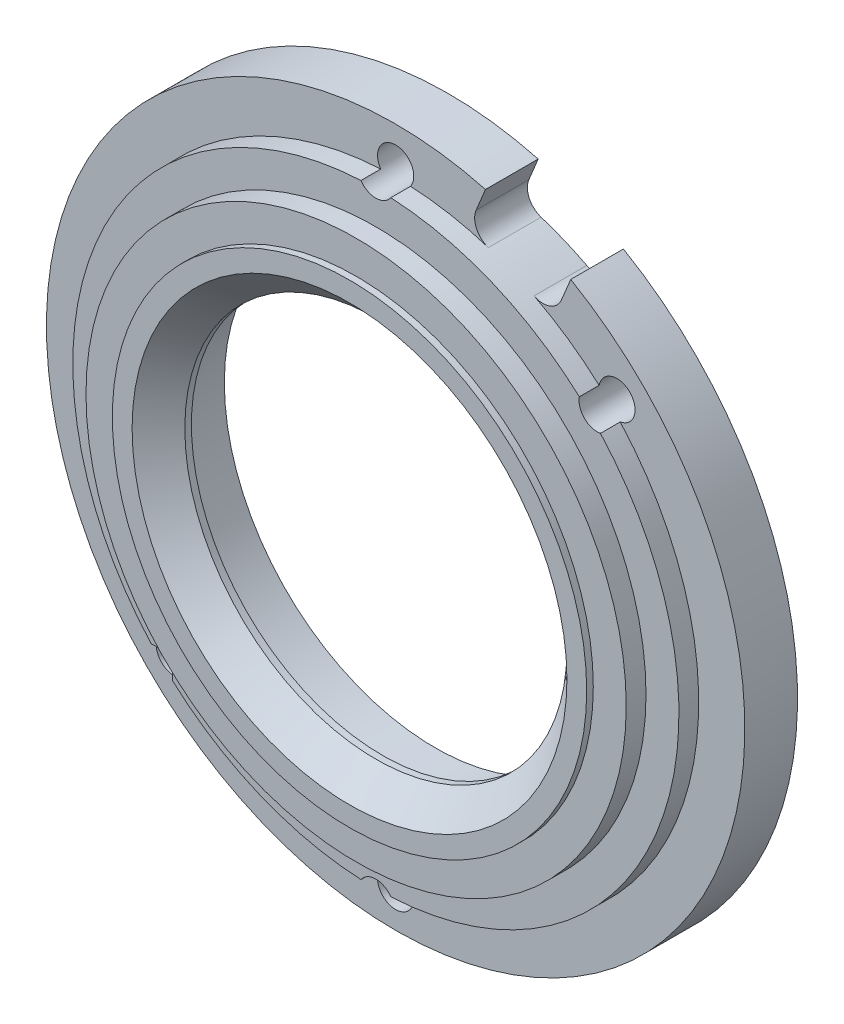
ISO-10303-21;
HEADER;
FILE_DESCRIPTION(('STEP AP214'),'2;1');
FILE_NAME('part.step','',(''),(''),'','','');
FILE_SCHEMA(('AUTOMOTIVE_DESIGN { 1 0 10303 214 1 1 1 1 }'));
ENDSEC;
DATA;
#1=APPLICATION_CONTEXT('core data for automotive mechanical design processes');
#2=APPLICATION_PROTOCOL_DEFINITION('international standard','automotive_design',2000,#1);
#3=PRODUCT_CONTEXT('',#1,'mechanical');
#4=PRODUCT('Part','Part','',(#3));
#5=PRODUCT_RELATED_PRODUCT_CATEGORY('part','',(#4));
#6=PRODUCT_DEFINITION_FORMATION('','',#4);
#7=PRODUCT_DEFINITION_CONTEXT('part definition',#1,'design');
#8=PRODUCT_DEFINITION('design','',#6,#7);
#9=PRODUCT_DEFINITION_SHAPE('','',#8);
#10=(LENGTH_UNIT() NAMED_UNIT(*) SI_UNIT(.MILLI.,.METRE.));
#11=(NAMED_UNIT(*) PLANE_ANGLE_UNIT() SI_UNIT($,.RADIAN.));
#12=(NAMED_UNIT(*) SI_UNIT($,.STERADIAN.) SOLID_ANGLE_UNIT());
#13=UNCERTAINTY_MEASURE_WITH_UNIT(LENGTH_MEASURE(1.E-05),#10,'distance_accuracy_value','');
#14=(GEOMETRIC_REPRESENTATION_CONTEXT(3) GLOBAL_UNCERTAINTY_ASSIGNED_CONTEXT((#13)) GLOBAL_UNIT_ASSIGNED_CONTEXT((#10,
#11,#12)) REPRESENTATION_CONTEXT('',''));
#15=CARTESIAN_POINT('',(0.,0.,0.));
#16=DIRECTION('',(0.,0.,1.));
#17=DIRECTION('',(1.,0.,0.));
#18=AXIS2_PLACEMENT_3D('',#15,#16,#17);
#19=CARTESIAN_POINT('',(0.,0.,-13.));
#20=DIRECTION('',(0.,0.,-1.));
#21=DIRECTION('',(-1.,0.,0.));
#22=AXIS2_PLACEMENT_3D('',#19,#20,#21);
#23=PLANE('',#22);
#24=CARTESIAN_POINT('',(0.,0.,-13.));
#25=DIRECTION('',(0.,0.,-1.));
#26=DIRECTION('',(-1.,0.,0.));
#27=AXIS2_PLACEMENT_3D('',#24,#25,#26);
#28=CIRCLE('',#27,32.);
#29=CARTESIAN_POINT('',(-32.,0.,-13.));
#30=VERTEX_POINT('',#29);
#31=EDGE_CURVE('E39',#30,#30,#28,.F.);
#32=ORIENTED_EDGE('',*,*,#31,.T.);
#33=EDGE_LOOP('',(#32));
#34=FACE_BOUND('',#33,.T.);
#35=CARTESIAN_POINT('',(0.,0.,-13.));
#36=DIRECTION('',(0.,0.,-1.));
#37=DIRECTION('',(-1.,0.,0.));
#38=AXIS2_PLACEMENT_3D('',#35,#36,#37);
#39=CIRCLE('',#38,40.25);
#40=CARTESIAN_POINT('',(-40.25,0.,-13.));
#41=VERTEX_POINT('',#40);
#42=EDGE_CURVE('E435',#41,#41,#39,.T.);
#43=ORIENTED_EDGE('',*,*,#42,.T.);
#44=EDGE_LOOP('',(#43));
#45=FACE_BOUND('',#44,.T.);
#46=ADVANCED_FACE('F35',(#34,#45),#23,.T.);
#47=CARTESIAN_POINT('',(0.,0.,0.));
#48=DIRECTION('',(0.,0.,1.));
#49=DIRECTION('',(1.,0.,0.));
#50=AXIS2_PLACEMENT_3D('',#47,#48,#49);
#51=CYLINDRICAL_SURFACE('',#50,32.);
#52=CARTESIAN_POINT('',(0.,0.,-5.));
#53=DIRECTION('',(0.,0.,1.));
#54=DIRECTION('',(1.,0.,0.));
#55=AXIS2_PLACEMENT_3D('',#52,#53,#54);
#56=CIRCLE('',#55,32.);
#57=CARTESIAN_POINT('',(32.,0.,-5.));
#58=VERTEX_POINT('',#57);
#59=EDGE_CURVE('E158',#58,#58,#56,.T.);
#60=ORIENTED_EDGE('',*,*,#59,.T.);
#61=EDGE_LOOP('',(#60));
#62=FACE_BOUND('',#61,.T.);
#63=ORIENTED_EDGE('',*,*,#31,.F.);
#64=EDGE_LOOP('',(#63));
#65=FACE_BOUND('',#64,.T.);
#66=ADVANCED_FACE('F305',(#62,#65),#51,.F.);
#67=CARTESIAN_POINT('',(0.,0.,0.));
#68=DIRECTION('',(0.,0.,1.));
#69=DIRECTION('',(1.,0.,0.));
#70=AXIS2_PLACEMENT_3D('',#67,#68,#69);
#71=CYLINDRICAL_SURFACE('',#70,46.);
#72=CARTESIAN_POINT('',(0.,0.,-4.));
#73=DIRECTION('',(0.,0.,1.));
#74=DIRECTION('',(1.,0.,0.));
#75=AXIS2_PLACEMENT_3D('',#72,#73,#74);
#76=CIRCLE('',#75,46.);
#77=CARTESIAN_POINT('',(-2.26751178122141,45.9440789473684,-4.));
#78=VERTEX_POINT('',#77);
#79=CARTESIAN_POINT('',(-34.0907427359764,-30.8839968221323,-4.));
#80=VERTEX_POINT('',#79);
#81=EDGE_CURVE('E380',#78,#80,#76,.T.);
#82=ORIENTED_EDGE('',*,*,#81,.F.);
#83=DIRECTION('',(0.,0.,-1.));
#84=VECTOR('',#83,1.);
#85=CARTESIAN_POINT('',(-2.26751178122141,45.9440789473684,-5.));
#86=LINE('',#85,#84);
#87=CARTESIAN_POINT('',(-2.26751178122143,45.9440789473684,-7.));
#88=VERTEX_POINT('',#87);
#89=EDGE_CURVE('E257',#78,#88,#86,.T.);
#90=ORIENTED_EDGE('',*,*,#89,.T.);
#91=CARTESIAN_POINT('',(0.,0.,-7.));
#92=DIRECTION('',(0.,0.,1.));
#93=DIRECTION('',(1.,0.,0.));
#94=AXIS2_PLACEMENT_3D('',#91,#92,#93);
#95=CIRCLE('',#94,46.);
#96=CARTESIAN_POINT('',(-34.0907427359764,-30.8839968221322,-7.));
#97=VERTEX_POINT('',#96);
#98=EDGE_CURVE('E392',#88,#97,#95,.T.);
#99=ORIENTED_EDGE('',*,*,#98,.T.);
#100=DIRECTION('',(0.,0.,-1.));
#101=VECTOR('',#100,1.);
#102=CARTESIAN_POINT('',(-34.0907427359764,-30.8839968221323,-5.));
#103=LINE('',#102,#101);
#104=EDGE_CURVE('E245',#97,#80,#103,.F.);
#105=ORIENTED_EDGE('',*,*,#104,.T.);
#106=EDGE_LOOP('',(#82,#90,#99,#105));
#107=FACE_BOUND('',#106,.T.);
#108=ADVANCED_FACE('F311',(#107),#71,.T.);
#109=CARTESIAN_POINT('',(-30.8839968221323,-34.0907427359764,-4.));
#110=VERTEX_POINT('',#109);
#111=CARTESIAN_POINT('',(-2.26751178122141,-45.9440789473684,-4.));
#112=VERTEX_POINT('',#111);
#113=EDGE_CURVE('E272',#110,#112,#76,.T.);
#114=ORIENTED_EDGE('',*,*,#113,.F.);
#115=DIRECTION('',(0.,0.,-1.));
#116=VECTOR('',#115,1.);
#117=CARTESIAN_POINT('',(-30.8839968221323,-34.0907427359764,-5.));
#118=LINE('',#117,#116);
#119=CARTESIAN_POINT('',(-30.8839968221322,-34.0907427359764,-7.));
#120=VERTEX_POINT('',#119);
#121=EDGE_CURVE('E248',#110,#120,#118,.T.);
#122=ORIENTED_EDGE('',*,*,#121,.T.);
#123=CARTESIAN_POINT('',(-2.26751178122144,-45.9440789473684,-7.));
#124=VERTEX_POINT('',#123);
#125=EDGE_CURVE('E267',#120,#124,#95,.T.);
#126=ORIENTED_EDGE('',*,*,#125,.T.);
#127=DIRECTION('',(0.,0.,-1.));
#128=VECTOR('',#127,1.);
#129=CARTESIAN_POINT('',(-2.26751178122141,-45.9440789473684,-5.));
#130=LINE('',#129,#128);
#131=EDGE_CURVE('E236',#124,#112,#130,.F.);
#132=ORIENTED_EDGE('',*,*,#131,.T.);
#133=EDGE_LOOP('',(#114,#122,#126,#132));
#134=FACE_BOUND('',#133,.T.);
#135=ADVANCED_FACE('F385',(#134),#71,.T.);
#136=CARTESIAN_POINT('',(2.2675117812214,-45.9440789473684,-4.));
#137=VERTEX_POINT('',#136);
#138=CARTESIAN_POINT('',(34.0907427359764,30.8839968221323,-4.));
#139=VERTEX_POINT('',#138);
#140=EDGE_CURVE('E269',#137,#139,#76,.T.);
#141=ORIENTED_EDGE('',*,*,#140,.F.);
#142=DIRECTION('',(0.,0.,-1.));
#143=VECTOR('',#142,1.);
#144=CARTESIAN_POINT('',(2.2675117812214,-45.9440789473684,-5.));
#145=LINE('',#144,#143);
#146=CARTESIAN_POINT('',(2.26751178122142,-45.9440789473684,-7.));
#147=VERTEX_POINT('',#146);
#148=EDGE_CURVE('E239',#137,#147,#145,.T.);
#149=ORIENTED_EDGE('',*,*,#148,.T.);
#150=CARTESIAN_POINT('',(34.0907427359764,30.8839968221322,-7.));
#151=VERTEX_POINT('',#150);
#152=EDGE_CURVE('E264',#147,#151,#95,.T.);
#153=ORIENTED_EDGE('',*,*,#152,.T.);
#154=DIRECTION('',(0.,0.,-1.));
#155=VECTOR('',#154,1.);
#156=CARTESIAN_POINT('',(34.0907427359764,30.8839968221323,-5.));
#157=LINE('',#156,#155);
#158=EDGE_CURVE('E219',#151,#139,#157,.F.);
#159=ORIENTED_EDGE('',*,*,#158,.T.);
#160=EDGE_LOOP('',(#141,#149,#153,#159));
#161=FACE_BOUND('',#160,.T.);
#162=ADVANCED_FACE('F352',(#161),#71,.T.);
#163=CARTESIAN_POINT('',(0.,0.,0.));
#164=DIRECTION('',(0.,0.,1.));
#165=DIRECTION('',(1.,0.,0.));
#166=AXIS2_PLACEMENT_3D('',#163,#164,#165);
#167=CYLINDRICAL_SURFACE('',#166,53.);
#168=CARTESIAN_POINT('',(0.,0.,-15.));
#169=DIRECTION('',(0.,0.,1.));
#170=DIRECTION('',(1.,0.,0.));
#171=AXIS2_PLACEMENT_3D('',#168,#169,#170);
#172=CIRCLE('',#171,53.);
#173=CARTESIAN_POINT('',(13.6373860914605,51.2154439655895,-15.));
#174=VERTEX_POINT('',#173);
#175=CARTESIAN_POINT('',(26.571699546618,45.8578759124771,-15.));
#176=VERTEX_POINT('',#175);
#177=EDGE_CURVE('E148',#174,#176,#172,.T.);
#178=ORIENTED_EDGE('',*,*,#177,.T.);
#179=DIRECTION('',(0.,0.,1.));
#180=VECTOR('',#179,1.);
#181=CARTESIAN_POINT('',(26.571699546618,45.8578759124771,-15.));
#182=LINE('',#181,#180);
#183=CARTESIAN_POINT('',(26.571699546618,45.8578759124771,-7.));
#184=VERTEX_POINT('',#183);
#185=EDGE_CURVE('E151',#176,#184,#182,.T.);
#186=ORIENTED_EDGE('',*,*,#185,.T.);
#187=CARTESIAN_POINT('',(0.,0.,-7.));
#188=DIRECTION('',(0.,0.,1.));
#189=DIRECTION('',(1.,0.,0.));
#190=AXIS2_PLACEMENT_3D('',#187,#188,#189);
#191=CIRCLE('',#190,53.);
#192=CARTESIAN_POINT('',(13.6373860914605,51.2154439655895,-7.));
#193=VERTEX_POINT('',#192);
#194=EDGE_CURVE('E150',#193,#184,#191,.T.);
#195=ORIENTED_EDGE('',*,*,#194,.F.);
#196=DIRECTION('',(0.,0.,1.));
#197=VECTOR('',#196,1.);
#198=CARTESIAN_POINT('',(13.6373860914605,51.2154439655895,-15.));
#199=LINE('',#198,#197);
#200=EDGE_CURVE('E136',#174,#193,#199,.T.);
#201=ORIENTED_EDGE('',*,*,#200,.F.);
#202=EDGE_LOOP('',(#178,#186,#195,#201));
#203=FACE_BOUND('',#202,.T.);
#204=ADVANCED_FACE('F146',(#203),#167,.T.);
#205=CARTESIAN_POINT('',(0.,53.,-15.));
#206=DIRECTION('',(0.,0.,1.));
#207=DIRECTION('',(1.,0.,0.));
#208=AXIS2_PLACEMENT_3D('',#205,#206,#207);
#209=PLANE('',#208);
#210=CARTESIAN_POINT('',(0.,0.,-15.));
#211=DIRECTION('',(0.,0.,-1.));
#212=DIRECTION('',(-1.,0.,0.));
#213=AXIS2_PLACEMENT_3D('',#210,#211,#212);
#214=CIRCLE('',#213,42.25);
#215=CARTESIAN_POINT('',(-42.25,0.,-15.));
#216=VERTEX_POINT('',#215);
#217=EDGE_CURVE('E420',#216,#216,#214,.T.);
#218=ORIENTED_EDGE('',*,*,#217,.F.);
#219=EDGE_LOOP('',(#218));
#220=FACE_BOUND('',#219,.T.);
#221=CARTESIAN_POINT('',(0.,47.5,-15.));
#222=DIRECTION('',(0.,0.,-1.));
#223=DIRECTION('',(-1.,0.,0.));
#224=AXIS2_PLACEMENT_3D('',#221,#222,#223);
#225=CIRCLE('',#224,2.75);
#226=CARTESIAN_POINT('',(-2.75,47.5,-15.));
#227=VERTEX_POINT('',#226);
#228=EDGE_CURVE('E216',#227,#227,#225,.T.);
#229=ORIENTED_EDGE('',*,*,#228,.F.);
#230=EDGE_LOOP('',(#229));
#231=FACE_BOUND('',#230,.T.);
#232=CARTESIAN_POINT('',(-33.587572106361,-33.587572106361,-15.));
#233=DIRECTION('',(0.,0.,-1.));
#234=DIRECTION('',(-1.,0.,0.));
#235=AXIS2_PLACEMENT_3D('',#232,#233,#234);
#236=CIRCLE('',#235,2.75);
#237=CARTESIAN_POINT('',(-36.337572106361,-33.587572106361,-15.));
#238=VERTEX_POINT('',#237);
#239=EDGE_CURVE('E220',#238,#238,#236,.T.);
#240=ORIENTED_EDGE('',*,*,#239,.F.);
#241=EDGE_LOOP('',(#240));
#242=FACE_BOUND('',#241,.T.);
#243=CARTESIAN_POINT('',(0.,-47.5,-15.));
#244=DIRECTION('',(0.,0.,-1.));
#245=DIRECTION('',(-1.,0.,0.));
#246=AXIS2_PLACEMENT_3D('',#243,#244,#245);
#247=CIRCLE('',#246,2.75);
#248=CARTESIAN_POINT('',(-2.75000000000001,-47.5,-15.));
#249=VERTEX_POINT('',#248);
#250=EDGE_CURVE('E223',#249,#249,#247,.T.);
#251=ORIENTED_EDGE('',*,*,#250,.F.);
#252=EDGE_LOOP('',(#251));
#253=FACE_BOUND('',#252,.T.);
#254=CARTESIAN_POINT('',(33.587572106361,33.587572106361,-15.));
#255=DIRECTION('',(0.,0.,-1.));
#256=DIRECTION('',(-1.,0.,0.));
#257=AXIS2_PLACEMENT_3D('',#254,#255,#256);
#258=CIRCLE('',#257,2.74999999999999);
#259=CARTESIAN_POINT('',(30.837572106361,33.587572106361,-15.));
#260=VERTEX_POINT('',#259);
#261=EDGE_CURVE('E214',#260,#260,#258,.T.);
#262=ORIENTED_EDGE('',*,*,#261,.F.);
#263=EDGE_LOOP('',(#262));
#264=FACE_BOUND('',#263,.T.);
#265=DIRECTION('',(-0.38268343236517,-0.923879532511254,0.));
#266=VECTOR('',#265,1.);
#267=CARTESIAN_POINT('',(13.6373860914605,51.2154439655895,-15.));
#268=LINE('',#267,#266);
#269=CARTESIAN_POINT('',(12.2217480941343,47.7977915130349,-15.));
#270=VERTEX_POINT('',#269);
#271=EDGE_CURVE('E133',#174,#270,#268,.T.);
#272=ORIENTED_EDGE('',*,*,#271,.T.);
#273=CARTESIAN_POINT('',(14.9933866916681,46.6497412159393,-15.));
#274=DIRECTION('',(0.,0.,1.));
#275=DIRECTION('',(1.,0.,0.));
#276=AXIS2_PLACEMENT_3D('',#273,#274,#275);
#277=CIRCLE('',#276,3.);
#278=CARTESIAN_POINT('',(14.0754242411576,43.7936346108813,-15.));
#279=VERTEX_POINT('',#278);
#280=EDGE_CURVE('E12',#270,#279,#277,.T.);
#281=ORIENTED_EDGE('',*,*,#280,.T.);
#282=CARTESIAN_POINT('',(0.,0.,-15.));
#283=DIRECTION('',(0.,0.,-1.));
#284=DIRECTION('',(1.,0.,0.));
#285=AXIS2_PLACEMENT_3D('',#282,#283,#284);
#286=CIRCLE('',#285,45.9999999999994);
#287=CARTESIAN_POINT('',(21.0139480771606,40.9196039351598,-15.));
#288=VERTEX_POINT('',#287);
#289=EDGE_CURVE('E140',#279,#288,#286,.T.);
#290=ORIENTED_EDGE('',*,*,#289,.T.);
#291=CARTESIAN_POINT('',(22.3844229517583,43.5882737570186,-15.));
#292=DIRECTION('',(0.,0.,1.));
#293=DIRECTION('',(1.,0.,0.));
#294=AXIS2_PLACEMENT_3D('',#291,#292,#293);
#295=CIRCLE('',#294,3.);
#296=CARTESIAN_POINT('',(25.1560615492921,42.4402234599231,-15.));
#297=VERTEX_POINT('',#296);
#298=EDGE_CURVE('E194',#288,#297,#295,.T.);
#299=ORIENTED_EDGE('',*,*,#298,.T.);
#300=DIRECTION('',(0.382683432365169,0.923879532511254,0.));
#301=VECTOR('',#300,1.);
#302=CARTESIAN_POINT('',(26.571699546618,45.8578759124771,-15.));
#303=LINE('',#302,#301);
#304=EDGE_CURVE('E152',#297,#176,#303,.T.);
#305=ORIENTED_EDGE('',*,*,#304,.T.);
#306=ORIENTED_EDGE('',*,*,#177,.F.);
#307=EDGE_LOOP('',(#272,#281,#290,#299,#305,#306));
#308=FACE_BOUND('',#307,.T.);
#309=ADVANCED_FACE('F154',(#220,#231,#242,#253,#264,#308),#209,.F.);
#310=CARTESIAN_POINT('',(0.,29.,-5.));
#311=DIRECTION('',(0.,0.,1.));
#312=DIRECTION('',(1.,0.,0.));
#313=AXIS2_PLACEMENT_3D('',#310,#311,#312);
#314=PLANE('',#313);
#315=ORIENTED_EDGE('',*,*,#59,.F.);
#316=EDGE_LOOP('',(#315));
#317=FACE_BOUND('',#316,.T.);
#318=CARTESIAN_POINT('',(0.,0.,-5.));
#319=DIRECTION('',(0.,0.,1.));
#320=DIRECTION('',(1.,0.,0.));
#321=AXIS2_PLACEMENT_3D('',#318,#319,#320);
#322=CIRCLE('',#321,29.);
#323=CARTESIAN_POINT('',(29.,0.,-5.));
#324=VERTEX_POINT('',#323);
#325=EDGE_CURVE('E164',#324,#324,#322,.T.);
#326=ORIENTED_EDGE('',*,*,#325,.T.);
#327=EDGE_LOOP('',(#326));
#328=FACE_BOUND('',#327,.T.);
#329=ADVANCED_FACE('F288',(#317,#328),#314,.F.);
#330=CARTESIAN_POINT('',(0.,0.,0.));
#331=DIRECTION('',(0.,0.,1.));
#332=DIRECTION('',(1.,0.,0.));
#333=AXIS2_PLACEMENT_3D('',#330,#331,#332);
#334=CYLINDRICAL_SURFACE('',#333,29.);
#335=CARTESIAN_POINT('',(0.,0.,-4.00000000000003));
#336=DIRECTION('',(0.,0.,-1.));
#337=DIRECTION('',(-1.,0.,0.));
#338=AXIS2_PLACEMENT_3D('',#335,#336,#337);
#339=CIRCLE('',#338,29.);
#340=CARTESIAN_POINT('',(-29.,0.,-4.00000000000003));
#341=VERTEX_POINT('',#340);
#342=EDGE_CURVE('E157',#341,#341,#339,.F.);
#343=ORIENTED_EDGE('',*,*,#342,.T.);
#344=EDGE_LOOP('',(#343));
#345=FACE_BOUND('',#344,.T.);
#346=ORIENTED_EDGE('',*,*,#325,.F.);
#347=EDGE_LOOP('',(#346));
#348=FACE_BOUND('',#347,.T.);
#349=ADVANCED_FACE('F290',(#345,#348),#334,.F.);
#350=CARTESIAN_POINT('',(0.,29.,0.));
#351=DIRECTION('',(0.,0.,-1.));
#352=DIRECTION('',(-1.,0.,0.));
#353=AXIS2_PLACEMENT_3D('',#350,#351,#352);
#354=PLANE('',#353);
#355=CARTESIAN_POINT('',(0.,0.,0.));
#356=DIRECTION('',(0.,0.,-1.));
#357=DIRECTION('',(-1.,0.,0.));
#358=AXIS2_PLACEMENT_3D('',#355,#356,#357);
#359=CIRCLE('',#358,33.);
#360=CARTESIAN_POINT('',(-33.,0.,0.));
#361=VERTEX_POINT('',#360);
#362=EDGE_CURVE('E161',#361,#361,#359,.T.);
#363=ORIENTED_EDGE('',*,*,#362,.T.);
#364=EDGE_LOOP('',(#363));
#365=FACE_BOUND('',#364,.T.);
#366=CARTESIAN_POINT('',(0.,0.,0.));
#367=DIRECTION('',(0.,0.,1.));
#368=DIRECTION('',(1.,0.,0.));
#369=AXIS2_PLACEMENT_3D('',#366,#367,#368);
#370=CIRCLE('',#369,36.);
#371=CARTESIAN_POINT('',(36.,0.,0.));
#372=VERTEX_POINT('',#371);
#373=EDGE_CURVE('E283',#372,#372,#370,.T.);
#374=ORIENTED_EDGE('',*,*,#373,.T.);
#375=EDGE_LOOP('',(#374));
#376=FACE_BOUND('',#375,.T.);
#377=ADVANCED_FACE('F292',(#365,#376),#354,.F.);
#378=CARTESIAN_POINT('',(0.,0.,0.));
#379=DIRECTION('',(0.,0.,1.));
#380=DIRECTION('',(1.,0.,0.));
#381=AXIS2_PLACEMENT_3D('',#378,#379,#380);
#382=CYLINDRICAL_SURFACE('',#381,36.);
#383=ORIENTED_EDGE('',*,*,#373,.F.);
#384=EDGE_LOOP('',(#383));
#385=FACE_BOUND('',#384,.T.);
#386=CARTESIAN_POINT('',(0.,0.,-1.));
#387=DIRECTION('',(0.,0.,1.));
#388=DIRECTION('',(1.,0.,0.));
#389=AXIS2_PLACEMENT_3D('',#386,#387,#388);
#390=CIRCLE('',#389,36.);
#391=CARTESIAN_POINT('',(36.,0.,-1.));
#392=VERTEX_POINT('',#391);
#393=EDGE_CURVE('E280',#392,#392,#390,.T.);
#394=ORIENTED_EDGE('',*,*,#393,.T.);
#395=EDGE_LOOP('',(#394));
#396=FACE_BOUND('',#395,.T.);
#397=ADVANCED_FACE('F299',(#385,#396),#382,.T.);
#398=CARTESIAN_POINT('',(0.,36.,-1.));
#399=DIRECTION('',(0.,0.,-1.));
#400=DIRECTION('',(-1.,0.,0.));
#401=AXIS2_PLACEMENT_3D('',#398,#399,#400);
#402=PLANE('',#401);
#403=ORIENTED_EDGE('',*,*,#393,.F.);
#404=EDGE_LOOP('',(#403));
#405=FACE_BOUND('',#404,.T.);
#406=CARTESIAN_POINT('',(0.,0.,-1.));
#407=DIRECTION('',(0.,0.,1.));
#408=DIRECTION('',(1.,0.,0.));
#409=AXIS2_PLACEMENT_3D('',#406,#407,#408);
#410=CIRCLE('',#409,41.);
#411=CARTESIAN_POINT('',(41.,0.,-1.));
#412=VERTEX_POINT('',#411);
#413=EDGE_CURVE('E277',#412,#412,#410,.T.);
#414=ORIENTED_EDGE('',*,*,#413,.T.);
#415=EDGE_LOOP('',(#414));
#416=FACE_BOUND('',#415,.T.);
#417=ADVANCED_FACE('F359',(#405,#416),#402,.F.);
#418=CARTESIAN_POINT('',(0.,0.,0.));
#419=DIRECTION('',(0.,0.,1.));
#420=DIRECTION('',(1.,0.,0.));
#421=AXIS2_PLACEMENT_3D('',#418,#419,#420);
#422=CYLINDRICAL_SURFACE('',#421,41.);
#423=ORIENTED_EDGE('',*,*,#413,.F.);
#424=EDGE_LOOP('',(#423));
#425=FACE_BOUND('',#424,.T.);
#426=CARTESIAN_POINT('',(0.,0.,-4.));
#427=DIRECTION('',(0.,0.,1.));
#428=DIRECTION('',(1.,0.,0.));
#429=AXIS2_PLACEMENT_3D('',#426,#427,#428);
#430=CIRCLE('',#429,41.);
#431=CARTESIAN_POINT('',(41.,0.,-4.));
#432=VERTEX_POINT('',#431);
#433=EDGE_CURVE('E274',#432,#432,#430,.T.);
#434=ORIENTED_EDGE('',*,*,#433,.T.);
#435=EDGE_LOOP('',(#434));
#436=FACE_BOUND('',#435,.T.);
#437=ADVANCED_FACE('F355',(#425,#436),#422,.T.);
#438=CARTESIAN_POINT('',(0.,41.,-4.));
#439=DIRECTION('',(0.,0.,-1.));
#440=DIRECTION('',(-1.,0.,0.));
#441=AXIS2_PLACEMENT_3D('',#438,#439,#440);
#442=PLANE('',#441);
#443=ORIENTED_EDGE('',*,*,#433,.F.);
#444=EDGE_LOOP('',(#443));
#445=FACE_BOUND('',#444,.T.);
#446=CARTESIAN_POINT('',(30.8839968221323,34.0907427359763,-4.));
#447=VERTEX_POINT('',#446);
#448=CARTESIAN_POINT('',(2.26751178122141,45.9440789473684,-4.));
#449=VERTEX_POINT('',#448);
#450=EDGE_CURVE('E273',#447,#449,#76,.T.);
#451=ORIENTED_EDGE('',*,*,#450,.T.);
#452=CARTESIAN_POINT('',(0.,47.5,-4.));
#453=DIRECTION('',(0.,0.,-1.));
#454=DIRECTION('',(-1.,0.,0.));
#455=AXIS2_PLACEMENT_3D('',#452,#453,#454);
#456=CIRCLE('',#455,2.75);
#457=EDGE_CURVE('E260',#449,#78,#456,.T.);
#458=ORIENTED_EDGE('',*,*,#457,.T.);
#459=ORIENTED_EDGE('',*,*,#81,.T.);
#460=CARTESIAN_POINT('',(-33.587572106361,-33.587572106361,-4.));
#461=DIRECTION('',(0.,0.,-1.));
#462=DIRECTION('',(-1.,0.,0.));
#463=AXIS2_PLACEMENT_3D('',#460,#461,#462);
#464=CIRCLE('',#463,2.75);
#465=EDGE_CURVE('E251',#80,#110,#464,.T.);
#466=ORIENTED_EDGE('',*,*,#465,.T.);
#467=ORIENTED_EDGE('',*,*,#113,.T.);
#468=CARTESIAN_POINT('',(0.,-47.5,-4.));
#469=DIRECTION('',(0.,0.,-1.));
#470=DIRECTION('',(-1.,0.,0.));
#471=AXIS2_PLACEMENT_3D('',#468,#469,#470);
#472=CIRCLE('',#471,2.75);
#473=EDGE_CURVE('E242',#112,#137,#472,.T.);
#474=ORIENTED_EDGE('',*,*,#473,.T.);
#475=ORIENTED_EDGE('',*,*,#140,.T.);
#476=CARTESIAN_POINT('',(33.587572106361,33.587572106361,-4.));
#477=DIRECTION('',(0.,0.,-1.));
#478=DIRECTION('',(-1.,0.,0.));
#479=AXIS2_PLACEMENT_3D('',#476,#477,#478);
#480=CIRCLE('',#479,2.74999999999999);
#481=EDGE_CURVE('E233',#139,#447,#480,.T.);
#482=ORIENTED_EDGE('',*,*,#481,.T.);
#483=EDGE_LOOP('',(#451,#458,#459,#466,#467,#474,#475,#482));
#484=FACE_BOUND('',#483,.T.);
#485=ADVANCED_FACE('F350',(#445,#484),#442,.F.);
#486=CARTESIAN_POINT('',(30.8839968221323,34.0907427359764,-7.));
#487=VERTEX_POINT('',#486);
#488=CARTESIAN_POINT('',(21.0139480771609,40.9196039351603,-7.));
#489=VERTEX_POINT('',#488);
#490=EDGE_CURVE('E209',#487,#489,#95,.T.);
#491=ORIENTED_EDGE('',*,*,#490,.T.);
#492=DIRECTION('',(0.,0.,1.));
#493=VECTOR('',#492,1.);
#494=CARTESIAN_POINT('',(21.0139480771609,40.9196039351603,0.));
#495=LINE('',#494,#493);
#496=EDGE_CURVE('E188',#489,#288,#495,.F.);
#497=ORIENTED_EDGE('',*,*,#496,.T.);
#498=ORIENTED_EDGE('',*,*,#289,.F.);
#499=DIRECTION('',(0.,0.,1.));
#500=VECTOR('',#499,1.);
#501=CARTESIAN_POINT('',(14.0754242411578,43.7936346108818,0.));
#502=LINE('',#501,#500);
#503=CARTESIAN_POINT('',(14.0754242411578,43.7936346108818,-7.));
#504=VERTEX_POINT('',#503);
#505=EDGE_CURVE('E185',#279,#504,#502,.T.);
#506=ORIENTED_EDGE('',*,*,#505,.T.);
#507=CARTESIAN_POINT('',(2.26751178122143,45.9440789473684,-7.));
#508=VERTEX_POINT('',#507);
#509=EDGE_CURVE('E268',#504,#508,#95,.T.);
#510=ORIENTED_EDGE('',*,*,#509,.T.);
#511=DIRECTION('',(0.,0.,-1.));
#512=VECTOR('',#511,1.);
#513=CARTESIAN_POINT('',(2.26751178122141,45.9440789473684,-5.));
#514=LINE('',#513,#512);
#515=EDGE_CURVE('E254',#508,#449,#514,.F.);
#516=ORIENTED_EDGE('',*,*,#515,.T.);
#517=ORIENTED_EDGE('',*,*,#450,.F.);
#518=DIRECTION('',(0.,0.,-1.));
#519=VECTOR('',#518,1.);
#520=CARTESIAN_POINT('',(30.8839968221323,34.0907427359763,-5.));
#521=LINE('',#520,#519);
#522=EDGE_CURVE('E230',#447,#487,#521,.T.);
#523=ORIENTED_EDGE('',*,*,#522,.T.);
#524=EDGE_LOOP('',(#491,#497,#498,#506,#510,#516,#517,#523));
#525=FACE_BOUND('',#524,.T.);
#526=ADVANCED_FACE('F347',(#525),#71,.T.);
#527=CARTESIAN_POINT('',(0.,46.,-7.));
#528=DIRECTION('',(0.,0.,-1.));
#529=DIRECTION('',(-1.,0.,0.));
#530=AXIS2_PLACEMENT_3D('',#527,#528,#529);
#531=PLANE('',#530);
#532=ORIENTED_EDGE('',*,*,#194,.T.);
#533=DIRECTION('',(0.382683432365169,0.923879532511254,0.));
#534=VECTOR('',#533,1.);
#535=CARTESIAN_POINT('',(26.571699546618,45.8578759124771,-7.));
#536=LINE('',#535,#534);
#537=CARTESIAN_POINT('',(25.1560615492921,42.4402234599231,-7.));
#538=VERTEX_POINT('',#537);
#539=EDGE_CURVE('E141',#538,#184,#536,.T.);
#540=ORIENTED_EDGE('',*,*,#539,.F.);
#541=CARTESIAN_POINT('',(22.3844229517583,43.5882737570186,-7.));
#542=DIRECTION('',(0.,0.,-1.));
#543=DIRECTION('',(-1.,0.,0.));
#544=AXIS2_PLACEMENT_3D('',#541,#542,#543);
#545=CIRCLE('',#544,3.);
#546=EDGE_CURVE('E191',#538,#489,#545,.T.);
#547=ORIENTED_EDGE('',*,*,#546,.T.);
#548=ORIENTED_EDGE('',*,*,#490,.F.);
#549=CARTESIAN_POINT('',(33.587572106361,33.587572106361,-7.));
#550=DIRECTION('',(0.,0.,-1.));
#551=DIRECTION('',(-1.,0.,0.));
#552=AXIS2_PLACEMENT_3D('',#549,#550,#551);
#553=CIRCLE('',#552,2.74999999999999);
#554=EDGE_CURVE('E170',#487,#151,#553,.T.);
#555=ORIENTED_EDGE('',*,*,#554,.T.);
#556=ORIENTED_EDGE('',*,*,#152,.F.);
#557=CARTESIAN_POINT('',(0.,-47.5,-7.));
#558=DIRECTION('',(0.,0.,-1.));
#559=DIRECTION('',(-1.,0.,0.));
#560=AXIS2_PLACEMENT_3D('',#557,#558,#559);
#561=CIRCLE('',#560,2.75);
#562=EDGE_CURVE('E173',#147,#124,#561,.T.);
#563=ORIENTED_EDGE('',*,*,#562,.T.);
#564=ORIENTED_EDGE('',*,*,#125,.F.);
#565=CARTESIAN_POINT('',(-33.587572106361,-33.587572106361,-7.));
#566=DIRECTION('',(0.,0.,-1.));
#567=DIRECTION('',(-1.,0.,0.));
#568=AXIS2_PLACEMENT_3D('',#565,#566,#567);
#569=CIRCLE('',#568,2.75);
#570=EDGE_CURVE('E176',#120,#97,#569,.T.);
#571=ORIENTED_EDGE('',*,*,#570,.T.);
#572=ORIENTED_EDGE('',*,*,#98,.F.);
#573=CARTESIAN_POINT('',(0.,47.5,-7.));
#574=DIRECTION('',(0.,0.,-1.));
#575=DIRECTION('',(-1.,0.,0.));
#576=AXIS2_PLACEMENT_3D('',#573,#574,#575);
#577=CIRCLE('',#576,2.75);
#578=EDGE_CURVE('E179',#88,#508,#577,.T.);
#579=ORIENTED_EDGE('',*,*,#578,.T.);
#580=ORIENTED_EDGE('',*,*,#509,.F.);
#581=CARTESIAN_POINT('',(14.9933866916681,46.6497412159393,-7.));
#582=DIRECTION('',(0.,0.,-1.));
#583=DIRECTION('',(-1.,0.,0.));
#584=AXIS2_PLACEMENT_3D('',#581,#582,#583);
#585=CIRCLE('',#584,3.);
#586=CARTESIAN_POINT('',(12.2217480941343,47.7977915130349,-7.));
#587=VERTEX_POINT('',#586);
#588=EDGE_CURVE('E44',#504,#587,#585,.T.);
#589=ORIENTED_EDGE('',*,*,#588,.T.);
#590=DIRECTION('',(-0.38268343236517,-0.923879532511254,0.));
#591=VECTOR('',#590,1.);
#592=CARTESIAN_POINT('',(13.6373860914605,51.2154439655895,-7.));
#593=LINE('',#592,#591);
#594=EDGE_CURVE('E210',#193,#587,#593,.T.);
#595=ORIENTED_EDGE('',*,*,#594,.F.);
#596=EDGE_LOOP('',(#532,#540,#547,#548,#555,#556,#563,#564,#571,#572,#579,#580,#589,#595));
#597=FACE_BOUND('',#596,.T.);
#598=ADVANCED_FACE('F208',(#597),#531,.F.);
#599=CARTESIAN_POINT('',(0.,0.,-4.00000000000003));
#600=DIRECTION('',(0.,0.,1.));
#601=DIRECTION('',(1.,0.,0.));
#602=AXIS2_PLACEMENT_3D('',#599,#600,#601);
#603=CONICAL_SURFACE('',#602,29.,0.78539816339745);
#604=ORIENTED_EDGE('',*,*,#362,.F.);
#605=EDGE_LOOP('',(#604));
#606=FACE_BOUND('',#605,.T.);
#607=ORIENTED_EDGE('',*,*,#342,.F.);
#608=EDGE_LOOP('',(#607));
#609=FACE_BOUND('',#608,.T.);
#610=ADVANCED_FACE('F343',(#606,#609),#603,.F.);
#611=CARTESIAN_POINT('',(33.587572106361,33.587572106361,5.));
#612=DIRECTION('',(0.,0.,-1.));
#613=DIRECTION('',(-1.,0.,0.));
#614=AXIS2_PLACEMENT_3D('',#611,#612,#613);
#615=CYLINDRICAL_SURFACE('',#614,2.74999999999999);
#616=ORIENTED_EDGE('',*,*,#261,.T.);
#617=EDGE_LOOP('',(#616));
#618=FACE_BOUND('',#617,.T.);
#619=ORIENTED_EDGE('',*,*,#158,.F.);
#620=ORIENTED_EDGE('',*,*,#554,.F.);
#621=ORIENTED_EDGE('',*,*,#522,.F.);
#622=ORIENTED_EDGE('',*,*,#481,.F.);
#623=EDGE_LOOP('',(#619,#620,#621,#622));
#624=FACE_BOUND('',#623,.T.);
#625=ADVANCED_FACE('F339',(#618,#624),#615,.F.);
#626=CARTESIAN_POINT('',(0.,-47.5,5.));
#627=DIRECTION('',(0.,0.,-1.));
#628=DIRECTION('',(-1.,0.,0.));
#629=AXIS2_PLACEMENT_3D('',#626,#627,#628);
#630=CYLINDRICAL_SURFACE('',#629,2.75);
#631=ORIENTED_EDGE('',*,*,#250,.T.);
#632=EDGE_LOOP('',(#631));
#633=FACE_BOUND('',#632,.T.);
#634=ORIENTED_EDGE('',*,*,#131,.F.);
#635=ORIENTED_EDGE('',*,*,#562,.F.);
#636=ORIENTED_EDGE('',*,*,#148,.F.);
#637=ORIENTED_EDGE('',*,*,#473,.F.);
#638=EDGE_LOOP('',(#634,#635,#636,#637));
#639=FACE_BOUND('',#638,.T.);
#640=ADVANCED_FACE('F335',(#633,#639),#630,.F.);
#641=CARTESIAN_POINT('',(-33.587572106361,-33.587572106361,5.));
#642=DIRECTION('',(0.,0.,-1.));
#643=DIRECTION('',(-1.,0.,0.));
#644=AXIS2_PLACEMENT_3D('',#641,#642,#643);
#645=CYLINDRICAL_SURFACE('',#644,2.75);
#646=ORIENTED_EDGE('',*,*,#239,.T.);
#647=EDGE_LOOP('',(#646));
#648=FACE_BOUND('',#647,.T.);
#649=ORIENTED_EDGE('',*,*,#104,.F.);
#650=ORIENTED_EDGE('',*,*,#570,.F.);
#651=ORIENTED_EDGE('',*,*,#121,.F.);
#652=ORIENTED_EDGE('',*,*,#465,.F.);
#653=EDGE_LOOP('',(#649,#650,#651,#652));
#654=FACE_BOUND('',#653,.T.);
#655=ADVANCED_FACE('F331',(#648,#654),#645,.F.);
#656=CARTESIAN_POINT('',(0.,47.5,5.));
#657=DIRECTION('',(0.,0.,-1.));
#658=DIRECTION('',(-1.,0.,0.));
#659=AXIS2_PLACEMENT_3D('',#656,#657,#658);
#660=CYLINDRICAL_SURFACE('',#659,2.75);
#661=ORIENTED_EDGE('',*,*,#228,.T.);
#662=EDGE_LOOP('',(#661));
#663=FACE_BOUND('',#662,.T.);
#664=ORIENTED_EDGE('',*,*,#515,.F.);
#665=ORIENTED_EDGE('',*,*,#578,.F.);
#666=ORIENTED_EDGE('',*,*,#89,.F.);
#667=ORIENTED_EDGE('',*,*,#457,.F.);
#668=EDGE_LOOP('',(#664,#665,#666,#667));
#669=FACE_BOUND('',#668,.T.);
#670=ADVANCED_FACE('F326',(#663,#669),#660,.F.);
#671=CARTESIAN_POINT('',(26.571699546618,45.8578759124771,-15.));
#672=DIRECTION('',(0.923879532511254,-0.382683432365169,0.));
#673=DIRECTION('',(0.382683432365169,0.923879532511254,0.));
#674=AXIS2_PLACEMENT_3D('',#671,#672,#673);
#675=PLANE('',#674);
#676=ORIENTED_EDGE('',*,*,#304,.F.);
#677=DIRECTION('',(0.,0.,-1.));
#678=VECTOR('',#677,1.);
#679=CARTESIAN_POINT('',(25.1560615492921,42.4402234599231,-7.));
#680=LINE('',#679,#678);
#681=EDGE_CURVE('E182',#297,#538,#680,.F.);
#682=ORIENTED_EDGE('',*,*,#681,.T.);
#683=ORIENTED_EDGE('',*,*,#539,.T.);
#684=ORIENTED_EDGE('',*,*,#185,.F.);
#685=EDGE_LOOP('',(#676,#682,#683,#684));
#686=FACE_BOUND('',#685,.T.);
#687=ADVANCED_FACE('F203',(#686),#675,.F.);
#688=CARTESIAN_POINT('',(13.6373860914605,51.2154439655895,-15.));
#689=DIRECTION('',(-0.923879532511254,0.38268343236517,0.));
#690=DIRECTION('',(-0.38268343236517,-0.923879532511254,0.));
#691=AXIS2_PLACEMENT_3D('',#688,#689,#690);
#692=PLANE('',#691);
#693=ORIENTED_EDGE('',*,*,#594,.T.);
#694=DIRECTION('',(0.,0.,-1.));
#695=VECTOR('',#694,1.);
#696=CARTESIAN_POINT('',(12.2217480941343,47.7977915130349,-15.));
#697=LINE('',#696,#695);
#698=EDGE_CURVE('E51',#587,#270,#697,.T.);
#699=ORIENTED_EDGE('',*,*,#698,.T.);
#700=ORIENTED_EDGE('',*,*,#271,.F.);
#701=ORIENTED_EDGE('',*,*,#200,.T.);
#702=EDGE_LOOP('',(#693,#699,#700,#701));
#703=FACE_BOUND('',#702,.T.);
#704=ADVANCED_FACE('F135',(#703),#692,.F.);
#705=CARTESIAN_POINT('',(22.3844229517583,43.5882737570186,0.));
#706=DIRECTION('',(0.,0.,1.));
#707=DIRECTION('',(1.,0.,0.));
#708=AXIS2_PLACEMENT_3D('',#705,#706,#707);
#709=CYLINDRICAL_SURFACE('',#708,3.);
#710=ORIENTED_EDGE('',*,*,#298,.F.);
#711=ORIENTED_EDGE('',*,*,#496,.F.);
#712=ORIENTED_EDGE('',*,*,#546,.F.);
#713=ORIENTED_EDGE('',*,*,#681,.F.);
#714=EDGE_LOOP('',(#710,#711,#712,#713));
#715=FACE_BOUND('',#714,.T.);
#716=ADVANCED_FACE('F206',(#715),#709,.F.);
#717=CARTESIAN_POINT('',(14.9933866916681,46.6497412159393,0.));
#718=DIRECTION('',(0.,0.,1.));
#719=DIRECTION('',(1.,0.,0.));
#720=AXIS2_PLACEMENT_3D('',#717,#718,#719);
#721=CYLINDRICAL_SURFACE('',#720,3.);
#722=ORIENTED_EDGE('',*,*,#280,.F.);
#723=ORIENTED_EDGE('',*,*,#698,.F.);
#724=ORIENTED_EDGE('',*,*,#588,.F.);
#725=ORIENTED_EDGE('',*,*,#505,.F.);
#726=EDGE_LOOP('',(#722,#723,#724,#725));
#727=FACE_BOUND('',#726,.T.);
#728=ADVANCED_FACE('F37',(#727),#721,.F.);
#729=CARTESIAN_POINT('',(0.,0.,-13.));
#730=DIRECTION('',(0.,0.,-1.));
#731=DIRECTION('',(-1.,0.,0.));
#732=AXIS2_PLACEMENT_3D('',#729,#730,#731);
#733=CYLINDRICAL_SURFACE('',#732,42.25);
#734=ORIENTED_EDGE('',*,*,#217,.T.);
#735=EDGE_LOOP('',(#734));
#736=FACE_BOUND('',#735,.T.);
#737=CARTESIAN_POINT('',(0.,0.,-9.));
#738=DIRECTION('',(0.,0.,-1.));
#739=DIRECTION('',(-1.,0.,0.));
#740=AXIS2_PLACEMENT_3D('',#737,#738,#739);
#741=CIRCLE('',#740,42.25);
#742=CARTESIAN_POINT('',(-42.25,0.,-9.));
#743=VERTEX_POINT('',#742);
#744=EDGE_CURVE('E428',#743,#743,#741,.T.);
#745=ORIENTED_EDGE('',*,*,#744,.F.);
#746=EDGE_LOOP('',(#745));
#747=FACE_BOUND('',#746,.T.);
#748=ADVANCED_FACE('F320',(#736,#747),#733,.F.);
#749=CARTESIAN_POINT('',(0.,0.,-9.));
#750=DIRECTION('',(0.,0.,-1.));
#751=DIRECTION('',(-1.,0.,0.));
#752=AXIS2_PLACEMENT_3D('',#749,#750,#751);
#753=PLANE('',#752);
#754=CARTESIAN_POINT('',(0.,0.,-9.));
#755=DIRECTION('',(0.,0.,-1.));
#756=DIRECTION('',(-1.,0.,0.));
#757=AXIS2_PLACEMENT_3D('',#754,#755,#756);
#758=CIRCLE('',#757,40.25);
#759=CARTESIAN_POINT('',(-40.25,0.,-9.));
#760=VERTEX_POINT('',#759);
#761=EDGE_CURVE('E431',#760,#760,#758,.T.);
#762=ORIENTED_EDGE('',*,*,#761,.F.);
#763=EDGE_LOOP('',(#762));
#764=FACE_BOUND('',#763,.T.);
#765=ORIENTED_EDGE('',*,*,#744,.T.);
#766=EDGE_LOOP('',(#765));
#767=FACE_BOUND('',#766,.T.);
#768=ADVANCED_FACE('F318',(#764,#767),#753,.T.);
#769=CARTESIAN_POINT('',(0.,0.,-9.));
#770=DIRECTION('',(0.,0.,-1.));
#771=DIRECTION('',(-1.,0.,0.));
#772=AXIS2_PLACEMENT_3D('',#769,#770,#771);
#773=CYLINDRICAL_SURFACE('',#772,40.25);
#774=ORIENTED_EDGE('',*,*,#761,.T.);
#775=EDGE_LOOP('',(#774));
#776=FACE_BOUND('',#775,.T.);
#777=ORIENTED_EDGE('',*,*,#42,.F.);
#778=EDGE_LOOP('',(#777));
#779=FACE_BOUND('',#778,.T.);
#780=ADVANCED_FACE('F441',(#776,#779),#773,.T.);
#781=CLOSED_SHELL('',(#46,#66,#108,#135,#162,#204,#309,#329,#349,#377,#397,#417,#437,#485,#526,
#598,#610,#625,#640,#655,#670,#687,#704,#716,#728,#748,#768,#780));
#782=MANIFOLD_SOLID_BREP('B2',#781);
#783=ADVANCED_BREP_SHAPE_REPRESENTATION('',(#18,#782),#14);
#784=SHAPE_DEFINITION_REPRESENTATION(#9,#783);
ENDSEC;
END-ISO-10303-21;
